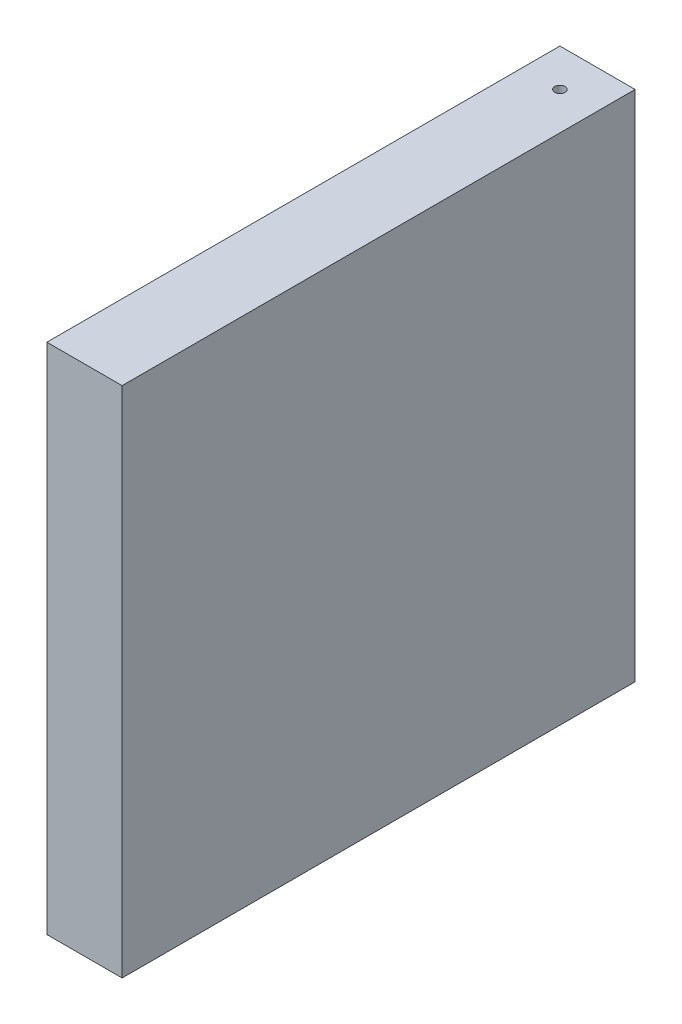
ISO-10303-21;
HEADER;
FILE_DESCRIPTION(('STEP AP214'),'2;1');
FILE_NAME('part.step','',(''),(''),'','','');
FILE_SCHEMA(('AUTOMOTIVE_DESIGN { 1 0 10303 214 1 1 1 1 }'));
ENDSEC;
DATA;
#1=APPLICATION_CONTEXT('core data for automotive mechanical design processes');
#2=APPLICATION_PROTOCOL_DEFINITION('international standard','automotive_design',2000,#1);
#3=PRODUCT_CONTEXT('',#1,'mechanical');
#4=PRODUCT('Part','Part','',(#3));
#5=PRODUCT_RELATED_PRODUCT_CATEGORY('part','',(#4));
#6=PRODUCT_DEFINITION_FORMATION('','',#4);
#7=PRODUCT_DEFINITION_CONTEXT('part definition',#1,'design');
#8=PRODUCT_DEFINITION('design','',#6,#7);
#9=PRODUCT_DEFINITION_SHAPE('','',#8);
#10=(LENGTH_UNIT() NAMED_UNIT(*) SI_UNIT(.MILLI.,.METRE.));
#11=(NAMED_UNIT(*) PLANE_ANGLE_UNIT() SI_UNIT($,.RADIAN.));
#12=(NAMED_UNIT(*) SI_UNIT($,.STERADIAN.) SOLID_ANGLE_UNIT());
#13=UNCERTAINTY_MEASURE_WITH_UNIT(LENGTH_MEASURE(1.E-05),#10,'distance_accuracy_value','');
#14=(GEOMETRIC_REPRESENTATION_CONTEXT(3) GLOBAL_UNCERTAINTY_ASSIGNED_CONTEXT((#13)) GLOBAL_UNIT_ASSIGNED_CONTEXT((#10,
#11,#12)) REPRESENTATION_CONTEXT('',''));
#15=CARTESIAN_POINT('',(0.,0.,0.));
#16=DIRECTION('',(0.,0.,1.));
#17=DIRECTION('',(1.,0.,0.));
#18=AXIS2_PLACEMENT_3D('',#15,#16,#17);
#19=CARTESIAN_POINT('',(33.5,75.,-15.));
#20=DIRECTION('',(0.,-1.,0.));
#21=DIRECTION('',(-1.,0.,0.));
#22=AXIS2_PLACEMENT_3D('',#19,#20,#21);
#23=CYLINDRICAL_SURFACE('',#22,1.5);
#24=CARTESIAN_POINT('',(33.5,75.,-15.));
#25=DIRECTION('',(0.,-1.,0.));
#26=DIRECTION('',(-1.,0.,0.));
#27=AXIS2_PLACEMENT_3D('',#24,#25,#26);
#28=CIRCLE('',#27,1.5);
#29=CARTESIAN_POINT('',(35.,75.,-15.));
#30=VERTEX_POINT('',#29);
#31=EDGE_CURVE('E20',#30,#30,#28,.T.);
#32=ORIENTED_EDGE('',*,*,#31,.F.);
#33=DIRECTION('',(0.,-1.,0.));
#34=VECTOR('',#33,1.);
#35=CARTESIAN_POINT('',(35.,75.,-15.));
#36=LINE('',#35,#34);
#37=CARTESIAN_POINT('',(35.,-75.,-15.));
#38=VERTEX_POINT('',#37);
#39=EDGE_CURVE('E11',#30,#38,#36,.T.);
#40=ORIENTED_EDGE('',*,*,#39,.T.);
#41=CARTESIAN_POINT('',(33.5,-75.,-15.));
#42=DIRECTION('',(0.,1.,0.));
#43=DIRECTION('',(-1.,0.,0.));
#44=AXIS2_PLACEMENT_3D('',#41,#42,#43);
#45=CIRCLE('',#44,1.5);
#46=EDGE_CURVE('E94',#38,#38,#45,.T.);
#47=ORIENTED_EDGE('',*,*,#46,.F.);
#48=ORIENTED_EDGE('',*,*,#39,.F.);
#49=EDGE_LOOP('',(#32,#40,#47,#48));
#50=FACE_BOUND('',#49,.T.);
#51=ADVANCED_FACE('F16',(#50),#23,.F.);
#52=CARTESIAN_POINT('',(33.5,-75.,49.));
#53=DIRECTION('',(0.,-1.,0.));
#54=DIRECTION('',(0.,0.,-1.));
#55=AXIS2_PLACEMENT_3D('',#52,#53,#54);
#56=PLANE('',#55);
#57=DIRECTION('',(0.,0.,1.));
#58=VECTOR('',#57,1.);
#59=CARTESIAN_POINT('',(44.5,-75.,124.));
#60=LINE('',#59,#58);
#61=CARTESIAN_POINT('',(44.5,-75.,-26.));
#62=VERTEX_POINT('',#61);
#63=CARTESIAN_POINT('',(44.5,-75.,124.));
#64=VERTEX_POINT('',#63);
#65=EDGE_CURVE('E27',#62,#64,#60,.T.);
#66=ORIENTED_EDGE('',*,*,#65,.T.);
#67=DIRECTION('',(-1.,0.,0.));
#68=VECTOR('',#67,1.);
#69=CARTESIAN_POINT('',(22.5,-75.,124.));
#70=LINE('',#69,#68);
#71=CARTESIAN_POINT('',(22.5,-75.,124.));
#72=VERTEX_POINT('',#71);
#73=EDGE_CURVE('E110',#64,#72,#70,.T.);
#74=ORIENTED_EDGE('',*,*,#73,.T.);
#75=DIRECTION('',(0.,0.,-1.));
#76=VECTOR('',#75,1.);
#77=CARTESIAN_POINT('',(22.5,-75.,-26.));
#78=LINE('',#77,#76);
#79=CARTESIAN_POINT('',(22.5,-75.,-26.));
#80=VERTEX_POINT('',#79);
#81=EDGE_CURVE('E91',#72,#80,#78,.T.);
#82=ORIENTED_EDGE('',*,*,#81,.T.);
#83=DIRECTION('',(1.,0.,0.));
#84=VECTOR('',#83,1.);
#85=CARTESIAN_POINT('',(44.5,-75.,-26.));
#86=LINE('',#85,#84);
#87=EDGE_CURVE('E113',#80,#62,#86,.T.);
#88=ORIENTED_EDGE('',*,*,#87,.T.);
#89=EDGE_LOOP('',(#66,#74,#82,#88));
#90=FACE_BOUND('',#89,.T.);
#91=ORIENTED_EDGE('',*,*,#46,.T.);
#92=EDGE_LOOP('',(#91));
#93=FACE_BOUND('',#92,.T.);
#94=ADVANCED_FACE('F141',(#90,#93),#56,.T.);
#95=CARTESIAN_POINT('',(22.5,0.,124.));
#96=DIRECTION('',(0.,0.,1.));
#97=DIRECTION('',(1.,0.,0.));
#98=AXIS2_PLACEMENT_3D('',#95,#96,#97);
#99=PLANE('',#98);
#100=DIRECTION('',(0.,-1.,0.));
#101=VECTOR('',#100,1.);
#102=CARTESIAN_POINT('',(44.5,0.,124.));
#103=LINE('',#102,#101);
#104=CARTESIAN_POINT('',(44.5,75.,124.));
#105=VERTEX_POINT('',#104);
#106=EDGE_CURVE('E79',#105,#64,#103,.T.);
#107=ORIENTED_EDGE('',*,*,#106,.F.);
#108=DIRECTION('',(1.,0.,0.));
#109=VECTOR('',#108,1.);
#110=CARTESIAN_POINT('',(22.5,75.,124.));
#111=LINE('',#110,#109);
#112=CARTESIAN_POINT('',(22.5,75.,124.));
#113=VERTEX_POINT('',#112);
#114=EDGE_CURVE('E74',#113,#105,#111,.T.);
#115=ORIENTED_EDGE('',*,*,#114,.F.);
#116=DIRECTION('',(0.,1.,0.));
#117=VECTOR('',#116,1.);
#118=CARTESIAN_POINT('',(22.5,0.,124.));
#119=LINE('',#118,#117);
#120=EDGE_CURVE('E77',#72,#113,#119,.T.);
#121=ORIENTED_EDGE('',*,*,#120,.F.);
#122=ORIENTED_EDGE('',*,*,#73,.F.);
#123=EDGE_LOOP('',(#107,#115,#121,#122));
#124=FACE_BOUND('',#123,.T.);
#125=ADVANCED_FACE('F76',(#124),#99,.T.);
#126=CARTESIAN_POINT('',(22.5,0.,-26.));
#127=DIRECTION('',(-1.,0.,0.));
#128=DIRECTION('',(0.,0.,1.));
#129=AXIS2_PLACEMENT_3D('',#126,#127,#128);
#130=PLANE('',#129);
#131=ORIENTED_EDGE('',*,*,#120,.T.);
#132=DIRECTION('',(0.,0.,1.));
#133=VECTOR('',#132,1.);
#134=CARTESIAN_POINT('',(22.5,75.,-26.));
#135=LINE('',#134,#133);
#136=CARTESIAN_POINT('',(22.5,75.,-26.));
#137=VERTEX_POINT('',#136);
#138=EDGE_CURVE('E85',#137,#113,#135,.T.);
#139=ORIENTED_EDGE('',*,*,#138,.F.);
#140=DIRECTION('',(0.,1.,0.));
#141=VECTOR('',#140,1.);
#142=CARTESIAN_POINT('',(22.5,0.,-26.));
#143=LINE('',#142,#141);
#144=EDGE_CURVE('E95',#80,#137,#143,.T.);
#145=ORIENTED_EDGE('',*,*,#144,.F.);
#146=ORIENTED_EDGE('',*,*,#81,.F.);
#147=EDGE_LOOP('',(#131,#139,#145,#146));
#148=FACE_BOUND('',#147,.T.);
#149=ADVANCED_FACE('F87',(#148),#130,.T.);
#150=CARTESIAN_POINT('',(44.5,0.,-26.));
#151=DIRECTION('',(0.,0.,-1.));
#152=DIRECTION('',(0.,-1.,0.));
#153=AXIS2_PLACEMENT_3D('',#150,#151,#152);
#154=PLANE('',#153);
#155=ORIENTED_EDGE('',*,*,#144,.T.);
#156=DIRECTION('',(-1.,0.,0.));
#157=VECTOR('',#156,1.);
#158=CARTESIAN_POINT('',(44.5,75.,-26.));
#159=LINE('',#158,#157);
#160=CARTESIAN_POINT('',(44.5,75.,-26.));
#161=VERTEX_POINT('',#160);
#162=EDGE_CURVE('E99',#161,#137,#159,.T.);
#163=ORIENTED_EDGE('',*,*,#162,.F.);
#164=DIRECTION('',(0.,1.,0.));
#165=VECTOR('',#164,1.);
#166=CARTESIAN_POINT('',(44.5,0.,-26.));
#167=LINE('',#166,#165);
#168=EDGE_CURVE('E120',#62,#161,#167,.T.);
#169=ORIENTED_EDGE('',*,*,#168,.F.);
#170=ORIENTED_EDGE('',*,*,#87,.F.);
#171=EDGE_LOOP('',(#155,#163,#169,#170));
#172=FACE_BOUND('',#171,.T.);
#173=ADVANCED_FACE('F151',(#172),#154,.T.);
#174=CARTESIAN_POINT('',(44.5,0.,124.));
#175=DIRECTION('',(1.,0.,0.));
#176=DIRECTION('',(0.,1.,0.));
#177=AXIS2_PLACEMENT_3D('',#174,#175,#176);
#178=PLANE('',#177);
#179=ORIENTED_EDGE('',*,*,#168,.T.);
#180=DIRECTION('',(0.,0.,-1.));
#181=VECTOR('',#180,1.);
#182=CARTESIAN_POINT('',(44.5,75.,124.));
#183=LINE('',#182,#181);
#184=EDGE_CURVE('E106',#105,#161,#183,.T.);
#185=ORIENTED_EDGE('',*,*,#184,.F.);
#186=ORIENTED_EDGE('',*,*,#106,.T.);
#187=ORIENTED_EDGE('',*,*,#65,.F.);
#188=EDGE_LOOP('',(#179,#185,#186,#187));
#189=FACE_BOUND('',#188,.T.);
#190=ADVANCED_FACE('F160',(#189),#178,.T.);
#191=CARTESIAN_POINT('',(33.5,75.,49.));
#192=DIRECTION('',(0.,1.,0.));
#193=DIRECTION('',(1.,0.,0.));
#194=AXIS2_PLACEMENT_3D('',#191,#192,#193);
#195=PLANE('',#194);
#196=ORIENTED_EDGE('',*,*,#184,.T.);
#197=ORIENTED_EDGE('',*,*,#162,.T.);
#198=ORIENTED_EDGE('',*,*,#138,.T.);
#199=ORIENTED_EDGE('',*,*,#114,.T.);
#200=EDGE_LOOP('',(#196,#197,#198,#199));
#201=FACE_BOUND('',#200,.T.);
#202=ORIENTED_EDGE('',*,*,#31,.T.);
#203=EDGE_LOOP('',(#202));
#204=FACE_BOUND('',#203,.T.);
#205=ADVANCED_FACE('F18',(#201,#204),#195,.T.);
#206=CLOSED_SHELL('',(#51,#94,#125,#149,#173,#190,#205));
#207=MANIFOLD_SOLID_BREP('B1',#206);
#208=ADVANCED_BREP_SHAPE_REPRESENTATION('',(#18,#207),#14);
#209=SHAPE_DEFINITION_REPRESENTATION(#9,#208);
ENDSEC;
END-ISO-10303-21;
